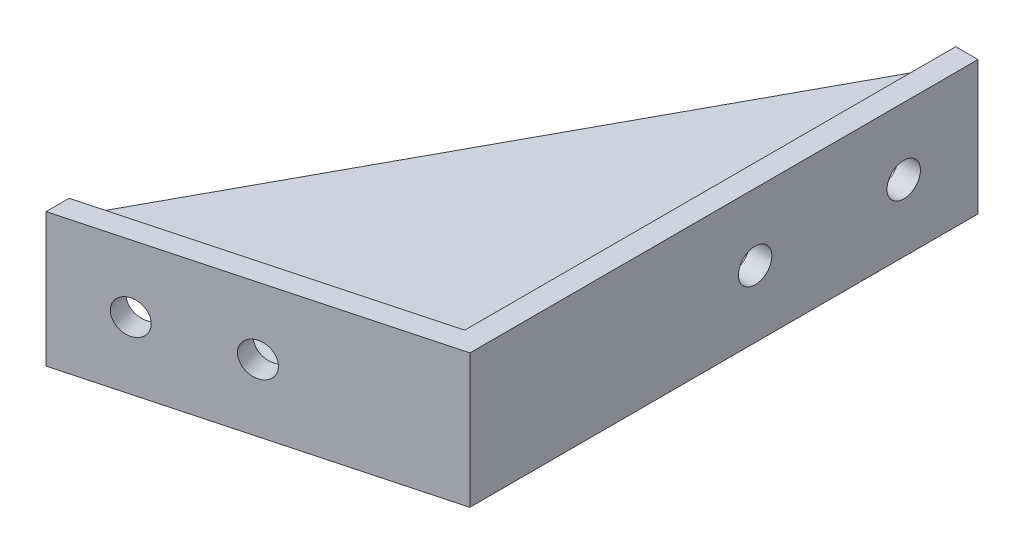
ISO-10303-21;
HEADER;
FILE_DESCRIPTION(('STEP AP214'),'2;1');
FILE_NAME('part.step','',(''),(''),'','','');
FILE_SCHEMA(('AUTOMOTIVE_DESIGN { 1 0 10303 214 1 1 1 1 }'));
ENDSEC;
DATA;
#1=APPLICATION_CONTEXT('core data for automotive mechanical design processes');
#2=APPLICATION_PROTOCOL_DEFINITION('international standard','automotive_design',2000,#1);
#3=PRODUCT_CONTEXT('',#1,'mechanical');
#4=PRODUCT('Part','Part','',(#3));
#5=PRODUCT_RELATED_PRODUCT_CATEGORY('part','',(#4));
#6=PRODUCT_DEFINITION_FORMATION('','',#4);
#7=PRODUCT_DEFINITION_CONTEXT('part definition',#1,'design');
#8=PRODUCT_DEFINITION('design','',#6,#7);
#9=PRODUCT_DEFINITION_SHAPE('','',#8);
#10=(LENGTH_UNIT() NAMED_UNIT(*) SI_UNIT(.MILLI.,.METRE.));
#11=(NAMED_UNIT(*) PLANE_ANGLE_UNIT() SI_UNIT($,.RADIAN.));
#12=(NAMED_UNIT(*) SI_UNIT($,.STERADIAN.) SOLID_ANGLE_UNIT());
#13=UNCERTAINTY_MEASURE_WITH_UNIT(LENGTH_MEASURE(1.E-05),#10,'distance_accuracy_value','');
#14=(GEOMETRIC_REPRESENTATION_CONTEXT(3) GLOBAL_UNCERTAINTY_ASSIGNED_CONTEXT((#13)) GLOBAL_UNIT_ASSIGNED_CONTEXT((#10,
#11,#12)) REPRESENTATION_CONTEXT('',''));
#15=CARTESIAN_POINT('',(0.,0.,0.));
#16=DIRECTION('',(0.,0.,1.));
#17=DIRECTION('',(1.,0.,0.));
#18=AXIS2_PLACEMENT_3D('',#15,#16,#17);
#19=CARTESIAN_POINT('',(-82.29236706485,11.5,1964.019125715));
#20=DIRECTION('',(0.,-1.,0.));
#21=DIRECTION('',(0.,0.,-1.));
#22=AXIS2_PLACEMENT_3D('',#19,#20,#21);
#23=PLANE('',#22);
#24=DIRECTION('',(-0.965925826288944,0.,0.258819045102985));
#25=VECTOR('',#24,1.);
#26=CARTESIAN_POINT('',(-56.,11.5,2005.396038073));
#27=LINE('',#26,#25);
#28=CARTESIAN_POINT('',(-56.,11.5,2005.396038073));
#29=VERTEX_POINT('',#28);
#30=CARTESIAN_POINT('',(-135.,11.5,2026.564024275));
#31=VERTEX_POINT('',#30);
#32=EDGE_CURVE('E170',#29,#31,#27,.T.);
#33=ORIENTED_EDGE('',*,*,#32,.T.);
#34=DIRECTION('',(0.477515999660203,0.,-0.878623053458374));
#35=VECTOR('',#34,1.);
#36=CARTESIAN_POINT('',(-135.,11.5,2026.564024275));
#37=LINE('',#36,#35);
#38=CARTESIAN_POINT('',(-56.,11.5,1881.205080758));
#39=VERTEX_POINT('',#38);
#40=EDGE_CURVE('E11',#31,#39,#37,.T.);
#41=ORIENTED_EDGE('',*,*,#40,.T.);
#42=DIRECTION('',(0.,0.,1.));
#43=VECTOR('',#42,1.);
#44=CARTESIAN_POINT('',(-56.,11.5,1881.205080758));
#45=LINE('',#44,#43);
#46=EDGE_CURVE('E171',#39,#29,#45,.T.);
#47=ORIENTED_EDGE('',*,*,#46,.T.);
#48=EDGE_LOOP('',(#33,#41,#47));
#49=FACE_BOUND('',#48,.T.);
#50=ADVANCED_FACE('F17',(#49),#23,.T.);
#51=CARTESIAN_POINT('',(-135.,11.5,2026.564024275));
#52=DIRECTION('',(-0.878623053458374,0.,-0.477515999660203));
#53=DIRECTION('',(-0.477515999660203,0.,0.878623053458374));
#54=AXIS2_PLACEMENT_3D('',#51,#52,#53);
#55=PLANE('',#54);
#56=DIRECTION('',(0.,1.,0.));
#57=VECTOR('',#56,1.);
#58=CARTESIAN_POINT('',(-135.,11.5,2026.564024275));
#59=LINE('',#58,#57);
#60=CARTESIAN_POINT('',(-135.,16.5,2026.564024275));
#61=VERTEX_POINT('',#60);
#62=EDGE_CURVE('E164',#31,#61,#59,.T.);
#63=ORIENTED_EDGE('',*,*,#62,.T.);
#64=DIRECTION('',(0.477515999660203,0.,-0.878623053458374));
#65=VECTOR('',#64,1.);
#66=CARTESIAN_POINT('',(-135.,16.5,2026.564024275));
#67=LINE('',#66,#65);
#68=CARTESIAN_POINT('',(-56.,16.5,1881.205080758));
#69=VERTEX_POINT('',#68);
#70=EDGE_CURVE('E25',#61,#69,#67,.T.);
#71=ORIENTED_EDGE('',*,*,#70,.T.);
#72=DIRECTION('',(0.,1.,0.));
#73=VECTOR('',#72,1.);
#74=CARTESIAN_POINT('',(-56.,11.5,1881.205080758));
#75=LINE('',#74,#73);
#76=EDGE_CURVE('E167',#39,#69,#75,.T.);
#77=ORIENTED_EDGE('',*,*,#76,.F.);
#78=ORIENTED_EDGE('',*,*,#40,.F.);
#79=EDGE_LOOP('',(#63,#71,#77,#78));
#80=FACE_BOUND('',#79,.T.);
#81=ADVANCED_FACE('F162',(#80),#55,.T.);
#82=CARTESIAN_POINT('',(-82.29236706485,-11.5,1964.019125715));
#83=DIRECTION('',(0.,-1.,0.));
#84=DIRECTION('',(0.,0.,-1.));
#85=AXIS2_PLACEMENT_3D('',#82,#83,#84);
#86=PLANE('',#85);
#87=DIRECTION('',(0.,0.,1.));
#88=VECTOR('',#87,1.);
#89=CARTESIAN_POINT('',(-56.,-11.5,1881.205080758));
#90=LINE('',#89,#88);
#91=CARTESIAN_POINT('',(-56.,-11.5,1881.205080758));
#92=VERTEX_POINT('',#91);
#93=CARTESIAN_POINT('',(-56.,-11.5,2005.396038073));
#94=VERTEX_POINT('',#93);
#95=EDGE_CURVE('E218',#92,#94,#90,.T.);
#96=ORIENTED_EDGE('',*,*,#95,.F.);
#97=DIRECTION('',(0.477515999660203,0.,-0.878623053458374));
#98=VECTOR('',#97,1.);
#99=CARTESIAN_POINT('',(-135.,-11.5,2026.564024275));
#100=LINE('',#99,#98);
#101=CARTESIAN_POINT('',(-135.,-11.5,2026.564024275));
#102=VERTEX_POINT('',#101);
#103=EDGE_CURVE('E228',#102,#92,#100,.T.);
#104=ORIENTED_EDGE('',*,*,#103,.F.);
#105=DIRECTION('',(-0.965925826288944,0.,0.258819045102985));
#106=VECTOR('',#105,1.);
#107=CARTESIAN_POINT('',(-56.,-11.5,2005.396038073));
#108=LINE('',#107,#106);
#109=EDGE_CURVE('E195',#94,#102,#108,.T.);
#110=ORIENTED_EDGE('',*,*,#109,.F.);
#111=EDGE_LOOP('',(#96,#104,#110));
#112=FACE_BOUND('',#111,.T.);
#113=ADVANCED_FACE('F394',(#112),#86,.F.);
#114=CARTESIAN_POINT('',(-82.29236706485,16.5,1964.019125715));
#115=DIRECTION('',(0.,-1.,0.));
#116=DIRECTION('',(0.,0.,-1.));
#117=AXIS2_PLACEMENT_3D('',#114,#115,#116);
#118=PLANE('',#117);
#119=DIRECTION('',(0.,0.,1.));
#120=VECTOR('',#119,1.);
#121=CARTESIAN_POINT('',(-56.,16.5,1881.205080758));
#122=LINE('',#121,#120);
#123=CARTESIAN_POINT('',(-56.,16.5,2005.396038073));
#124=VERTEX_POINT('',#123);
#125=EDGE_CURVE('E225',#69,#124,#122,.T.);
#126=ORIENTED_EDGE('',*,*,#125,.F.);
#127=ORIENTED_EDGE('',*,*,#70,.F.);
#128=DIRECTION('',(-0.965925826288944,0.,0.258819045102985));
#129=VECTOR('',#128,1.);
#130=CARTESIAN_POINT('',(-56.,16.5,2005.396038073));
#131=LINE('',#130,#129);
#132=EDGE_CURVE('E182',#124,#61,#131,.T.);
#133=ORIENTED_EDGE('',*,*,#132,.F.);
#134=EDGE_LOOP('',(#126,#127,#133));
#135=FACE_BOUND('',#134,.T.);
#136=ADVANCED_FACE('F385',(#135),#118,.F.);
#137=CARTESIAN_POINT('',(-135.,-16.5,2026.564024275));
#138=DIRECTION('',(-0.878623053458374,0.,-0.477515999660203));
#139=DIRECTION('',(-0.477515999660203,0.,0.878623053458374));
#140=AXIS2_PLACEMENT_3D('',#137,#138,#139);
#141=PLANE('',#140);
#142=DIRECTION('',(0.,1.,0.));
#143=VECTOR('',#142,1.);
#144=CARTESIAN_POINT('',(-135.,-16.5,2026.564024275));
#145=LINE('',#144,#143);
#146=CARTESIAN_POINT('',(-135.,-16.5,2026.564024275));
#147=VERTEX_POINT('',#146);
#148=EDGE_CURVE('E199',#147,#102,#145,.T.);
#149=ORIENTED_EDGE('',*,*,#148,.T.);
#150=ORIENTED_EDGE('',*,*,#103,.T.);
#151=DIRECTION('',(0.,1.,0.));
#152=VECTOR('',#151,1.);
#153=CARTESIAN_POINT('',(-56.,-16.5,1881.205080758));
#154=LINE('',#153,#152);
#155=CARTESIAN_POINT('',(-56.,-16.5,1881.205080758));
#156=VERTEX_POINT('',#155);
#157=EDGE_CURVE('E214',#156,#92,#154,.T.);
#158=ORIENTED_EDGE('',*,*,#157,.F.);
#159=DIRECTION('',(0.477515999660203,0.,-0.878623053458374));
#160=VECTOR('',#159,1.);
#161=CARTESIAN_POINT('',(-135.,-16.5,2026.564024275));
#162=LINE('',#161,#160);
#163=EDGE_CURVE('E226',#147,#156,#162,.T.);
#164=ORIENTED_EDGE('',*,*,#163,.F.);
#165=EDGE_LOOP('',(#149,#150,#158,#164));
#166=FACE_BOUND('',#165,.T.);
#167=ADVANCED_FACE('F383',(#166),#141,.T.);
#168=CARTESIAN_POINT('',(-82.29236706485,-16.5,1964.019125715));
#169=DIRECTION('',(0.,-1.,0.));
#170=DIRECTION('',(0.,0.,-1.));
#171=AXIS2_PLACEMENT_3D('',#168,#169,#170);
#172=PLANE('',#171);
#173=DIRECTION('',(-0.965925826288944,0.,0.258819045102985));
#174=VECTOR('',#173,1.);
#175=CARTESIAN_POINT('',(-56.,-16.5,2005.396038073));
#176=LINE('',#175,#174);
#177=CARTESIAN_POINT('',(-56.,-16.5,2005.396038073));
#178=VERTEX_POINT('',#177);
#179=EDGE_CURVE('E203',#178,#147,#176,.T.);
#180=ORIENTED_EDGE('',*,*,#179,.T.);
#181=ORIENTED_EDGE('',*,*,#163,.T.);
#182=DIRECTION('',(0.,0.,1.));
#183=VECTOR('',#182,1.);
#184=CARTESIAN_POINT('',(-56.,-16.5,1881.205080758));
#185=LINE('',#184,#183);
#186=EDGE_CURVE('E211',#156,#178,#185,.T.);
#187=ORIENTED_EDGE('',*,*,#186,.T.);
#188=EDGE_LOOP('',(#180,#181,#187));
#189=FACE_BOUND('',#188,.T.);
#190=ADVANCED_FACE('F382',(#189),#172,.T.);
#191=CARTESIAN_POINT('',(-56.,-18.,2005.396038073));
#192=DIRECTION('',(-1.,0.,0.));
#193=DIRECTION('',(0.,0.,1.));
#194=AXIS2_PLACEMENT_3D('',#191,#192,#193);
#195=PLANE('',#194);
#196=CARTESIAN_POINT('',(-56.,0.,1893.205080758));
#197=DIRECTION('',(-1.,0.,0.));
#198=DIRECTION('',(0.,0.,-1.));
#199=AXIS2_PLACEMENT_3D('',#196,#197,#198);
#200=CIRCLE('',#199,4.5);
#201=CARTESIAN_POINT('',(-56.,0.,1888.705080758));
#202=VERTEX_POINT('',#201);
#203=EDGE_CURVE('E280',#202,#202,#200,.T.);
#204=ORIENTED_EDGE('',*,*,#203,.F.);
#205=EDGE_LOOP('',(#204));
#206=FACE_BOUND('',#205,.T.);
#207=CARTESIAN_POINT('',(-56.,0.,1933.205080758));
#208=DIRECTION('',(-1.,0.,0.));
#209=DIRECTION('',(0.,0.,-1.));
#210=AXIS2_PLACEMENT_3D('',#207,#208,#209);
#211=CIRCLE('',#210,4.5);
#212=CARTESIAN_POINT('',(-56.,0.,1928.705080758));
#213=VERTEX_POINT('',#212);
#214=EDGE_CURVE('E288',#213,#213,#211,.T.);
#215=ORIENTED_EDGE('',*,*,#214,.F.);
#216=EDGE_LOOP('',(#215));
#217=FACE_BOUND('',#216,.T.);
#218=DIRECTION('',(0.,0.,-1.));
#219=VECTOR('',#218,1.);
#220=CARTESIAN_POINT('',(-56.,-18.,2005.396038073));
#221=LINE('',#220,#219);
#222=CARTESIAN_POINT('',(-56.,-18.,2005.396038073));
#223=VERTEX_POINT('',#222);
#224=CARTESIAN_POINT('',(-56.,-18.,1873.205080758));
#225=VERTEX_POINT('',#224);
#226=EDGE_CURVE('E254',#223,#225,#221,.T.);
#227=ORIENTED_EDGE('',*,*,#226,.F.);
#228=DIRECTION('',(0.,1.,0.));
#229=VECTOR('',#228,1.);
#230=CARTESIAN_POINT('',(-56.,-18.,2005.396038073));
#231=LINE('',#230,#229);
#232=EDGE_CURVE('E207',#223,#178,#231,.T.);
#233=ORIENTED_EDGE('',*,*,#232,.T.);
#234=ORIENTED_EDGE('',*,*,#186,.F.);
#235=ORIENTED_EDGE('',*,*,#157,.T.);
#236=ORIENTED_EDGE('',*,*,#95,.T.);
#237=DIRECTION('',(0.,1.,0.));
#238=VECTOR('',#237,1.);
#239=CARTESIAN_POINT('',(-56.,-18.,2005.396038073));
#240=LINE('',#239,#238);
#241=EDGE_CURVE('E176',#94,#29,#240,.T.);
#242=ORIENTED_EDGE('',*,*,#241,.T.);
#243=ORIENTED_EDGE('',*,*,#46,.F.);
#244=ORIENTED_EDGE('',*,*,#76,.T.);
#245=ORIENTED_EDGE('',*,*,#125,.T.);
#246=DIRECTION('',(0.,1.,0.));
#247=VECTOR('',#246,1.);
#248=CARTESIAN_POINT('',(-56.,-18.,2005.396038073));
#249=LINE('',#248,#247);
#250=CARTESIAN_POINT('',(-56.,18.,2005.396038073));
#251=VERTEX_POINT('',#250);
#252=EDGE_CURVE('E188',#124,#251,#249,.T.);
#253=ORIENTED_EDGE('',*,*,#252,.T.);
#254=DIRECTION('',(0.,0.,-1.));
#255=VECTOR('',#254,1.);
#256=CARTESIAN_POINT('',(-56.,18.,2005.396038073));
#257=LINE('',#256,#255);
#258=CARTESIAN_POINT('',(-56.,18.,1873.205080758));
#259=VERTEX_POINT('',#258);
#260=EDGE_CURVE('E249',#251,#259,#257,.T.);
#261=ORIENTED_EDGE('',*,*,#260,.T.);
#262=DIRECTION('',(0.,1.,0.));
#263=VECTOR('',#262,1.);
#264=CARTESIAN_POINT('',(-56.,-18.,1873.205080758));
#265=LINE('',#264,#263);
#266=EDGE_CURVE('E274',#225,#259,#265,.T.);
#267=ORIENTED_EDGE('',*,*,#266,.F.);
#268=EDGE_LOOP('',(#227,#233,#234,#235,#236,#242,#243,#244,#245,#253,#261,#267));
#269=FACE_BOUND('',#268,.T.);
#270=ADVANCED_FACE('F374',(#206,#217,#269),#195,.T.);
#271=CARTESIAN_POINT('',(-140.,-18.,2027.903770237));
#272=DIRECTION('',(-0.258819045102985,0.,-0.965925826288944));
#273=DIRECTION('',(-0.965925826288944,0.,0.258819045102985));
#274=AXIS2_PLACEMENT_3D('',#271,#272,#273);
#275=PLANE('',#274);
#276=CARTESIAN_POINT('',(-96.55291427061,0.,2016.262158703));
#277=DIRECTION('',(0.258819045102985,0.,0.965925826288944));
#278=DIRECTION('',(0.965925826288944,0.,-0.258819045102985));
#279=AXIS2_PLACEMENT_3D('',#276,#277,#278);
#280=CIRCLE('',#279,4.5);
#281=CARTESIAN_POINT('',(-92.20624805231,0.,2015.097473));
#282=VERTEX_POINT('',#281);
#283=EDGE_CURVE('E265',#282,#282,#280,.T.);
#284=ORIENTED_EDGE('',*,*,#283,.T.);
#285=EDGE_LOOP('',(#284));
#286=FACE_BOUND('',#285,.T.);
#287=CARTESIAN_POINT('',(-123.5529142706,0.,2023.496786898));
#288=DIRECTION('',(0.258819045102985,0.,0.965925826288944));
#289=DIRECTION('',(0.965925826288944,0.,-0.258819045102985));
#290=AXIS2_PLACEMENT_3D('',#287,#288,#289);
#291=CIRCLE('',#290,4.5);
#292=CARTESIAN_POINT('',(-119.2062480523,0.,2022.332101195));
#293=VERTEX_POINT('',#292);
#294=EDGE_CURVE('E271',#293,#293,#291,.T.);
#295=ORIENTED_EDGE('',*,*,#294,.T.);
#296=EDGE_LOOP('',(#295));
#297=FACE_BOUND('',#296,.T.);
#298=DIRECTION('',(0.965925826288944,0.,-0.258819045102985));
#299=VECTOR('',#298,1.);
#300=CARTESIAN_POINT('',(-140.,-18.,2027.903770237));
#301=LINE('',#300,#299);
#302=CARTESIAN_POINT('',(-140.,-18.,2027.903770237));
#303=VERTEX_POINT('',#302);
#304=EDGE_CURVE('E241',#303,#223,#301,.T.);
#305=ORIENTED_EDGE('',*,*,#304,.F.);
#306=DIRECTION('',(0.,1.,0.));
#307=VECTOR('',#306,1.);
#308=CARTESIAN_POINT('',(-140.,-18.,2027.903770237));
#309=LINE('',#308,#307);
#310=CARTESIAN_POINT('',(-140.,18.,2027.903770237));
#311=VERTEX_POINT('',#310);
#312=EDGE_CURVE('E261',#303,#311,#309,.T.);
#313=ORIENTED_EDGE('',*,*,#312,.T.);
#314=DIRECTION('',(0.965925826288944,0.,-0.258819045102985));
#315=VECTOR('',#314,1.);
#316=CARTESIAN_POINT('',(-140.,18.,2027.903770237));
#317=LINE('',#316,#315);
#318=EDGE_CURVE('E244',#311,#251,#317,.T.);
#319=ORIENTED_EDGE('',*,*,#318,.T.);
#320=ORIENTED_EDGE('',*,*,#252,.F.);
#321=ORIENTED_EDGE('',*,*,#132,.T.);
#322=ORIENTED_EDGE('',*,*,#62,.F.);
#323=ORIENTED_EDGE('',*,*,#32,.F.);
#324=ORIENTED_EDGE('',*,*,#241,.F.);
#325=ORIENTED_EDGE('',*,*,#109,.T.);
#326=ORIENTED_EDGE('',*,*,#148,.F.);
#327=ORIENTED_EDGE('',*,*,#179,.F.);
#328=ORIENTED_EDGE('',*,*,#232,.F.);
#329=EDGE_LOOP('',(#305,#313,#319,#320,#321,#322,#323,#324,#325,#326,#327,#328));
#330=FACE_BOUND('',#329,.T.);
#331=ADVANCED_FACE('F179',(#286,#297,#330),#275,.T.);
#332=CARTESIAN_POINT('',(-49.,0.,1933.205080758));
#333=DIRECTION('',(-1.,0.,0.));
#334=DIRECTION('',(0.,0.,-1.));
#335=AXIS2_PLACEMENT_3D('',#332,#333,#334);
#336=CYLINDRICAL_SURFACE('',#335,4.5);
#337=DIRECTION('',(-1.,0.,0.));
#338=VECTOR('',#337,1.);
#339=CARTESIAN_POINT('',(-49.,0.,1928.705080758));
#340=LINE('',#339,#338);
#341=CARTESIAN_POINT('',(-50.,0.,1928.705080758));
#342=VERTEX_POINT('',#341);
#343=EDGE_CURVE('E282',#342,#213,#340,.T.);
#344=ORIENTED_EDGE('',*,*,#343,.F.);
#345=CARTESIAN_POINT('',(-50.,0.,1933.205080758));
#346=DIRECTION('',(-1.,0.,0.));
#347=DIRECTION('',(0.,0.,-1.));
#348=AXIS2_PLACEMENT_3D('',#345,#346,#347);
#349=CIRCLE('',#348,4.5);
#350=EDGE_CURVE('E299',#342,#342,#349,.T.);
#351=ORIENTED_EDGE('',*,*,#350,.F.);
#352=ORIENTED_EDGE('',*,*,#343,.T.);
#353=ORIENTED_EDGE('',*,*,#214,.T.);
#354=EDGE_LOOP('',(#344,#351,#352,#353));
#355=FACE_BOUND('',#354,.T.);
#356=ADVANCED_FACE('F414',(#355),#336,.F.);
#357=CARTESIAN_POINT('',(-49.,0.,1893.205080758));
#358=DIRECTION('',(-1.,0.,0.));
#359=DIRECTION('',(0.,0.,-1.));
#360=AXIS2_PLACEMENT_3D('',#357,#358,#359);
#361=CYLINDRICAL_SURFACE('',#360,4.5);
#362=DIRECTION('',(-1.,0.,0.));
#363=VECTOR('',#362,1.);
#364=CARTESIAN_POINT('',(-49.,0.,1888.705080758));
#365=LINE('',#364,#363);
#366=CARTESIAN_POINT('',(-50.,0.,1888.705080758));
#367=VERTEX_POINT('',#366);
#368=EDGE_CURVE('E277',#367,#202,#365,.T.);
#369=ORIENTED_EDGE('',*,*,#368,.F.);
#370=CARTESIAN_POINT('',(-50.,0.,1893.205080758));
#371=DIRECTION('',(-1.,0.,0.));
#372=DIRECTION('',(0.,0.,-1.));
#373=AXIS2_PLACEMENT_3D('',#370,#371,#372);
#374=CIRCLE('',#373,4.5);
#375=EDGE_CURVE('E300',#367,#367,#374,.T.);
#376=ORIENTED_EDGE('',*,*,#375,.F.);
#377=ORIENTED_EDGE('',*,*,#368,.T.);
#378=ORIENTED_EDGE('',*,*,#203,.T.);
#379=EDGE_LOOP('',(#369,#376,#377,#378));
#380=FACE_BOUND('',#379,.T.);
#381=ADVANCED_FACE('F416',(#380),#361,.F.);
#382=CARTESIAN_POINT('',(-56.,-18.,1873.205080758));
#383=DIRECTION('',(0.,0.,-1.));
#384=DIRECTION('',(0.,-1.,0.));
#385=AXIS2_PLACEMENT_3D('',#382,#383,#384);
#386=PLANE('',#385);
#387=ORIENTED_EDGE('',*,*,#266,.T.);
#388=DIRECTION('',(1.,0.,0.));
#389=VECTOR('',#388,1.);
#390=CARTESIAN_POINT('',(-56.,18.,1873.205080758));
#391=LINE('',#390,#389);
#392=CARTESIAN_POINT('',(-50.,18.,1873.205080758));
#393=VERTEX_POINT('',#392);
#394=EDGE_CURVE('E253',#259,#393,#391,.T.);
#395=ORIENTED_EDGE('',*,*,#394,.T.);
#396=DIRECTION('',(0.,1.,0.));
#397=VECTOR('',#396,1.);
#398=CARTESIAN_POINT('',(-50.,-18.,1873.205080758));
#399=LINE('',#398,#397);
#400=CARTESIAN_POINT('',(-50.,-18.,1873.205080758));
#401=VERTEX_POINT('',#400);
#402=EDGE_CURVE('E307',#401,#393,#399,.T.);
#403=ORIENTED_EDGE('',*,*,#402,.F.);
#404=DIRECTION('',(1.,0.,0.));
#405=VECTOR('',#404,1.);
#406=CARTESIAN_POINT('',(-56.,-18.,1873.205080758));
#407=LINE('',#406,#405);
#408=EDGE_CURVE('E250',#225,#401,#407,.T.);
#409=ORIENTED_EDGE('',*,*,#408,.F.);
#410=EDGE_LOOP('',(#387,#395,#403,#409));
#411=FACE_BOUND('',#410,.T.);
#412=ADVANCED_FACE('F372',(#411),#386,.T.);
#413=CARTESIAN_POINT('',(-123.8117333157,0.,2022.530861072));
#414=DIRECTION('',(0.258819045102985,0.,0.965925826288944));
#415=DIRECTION('',(0.965925826288944,0.,-0.258819045102985));
#416=AXIS2_PLACEMENT_3D('',#413,#414,#415);
#417=CYLINDRICAL_SURFACE('',#416,4.5);
#418=DIRECTION('',(0.258819045102985,0.,0.965925826288944));
#419=VECTOR('',#418,1.);
#420=CARTESIAN_POINT('',(-119.4650670974,0.,2021.366175369));
#421=LINE('',#420,#419);
#422=CARTESIAN_POINT('',(-117.6533337816,0.,2028.127656153));
#423=VERTEX_POINT('',#422);
#424=EDGE_CURVE('E268',#293,#423,#421,.T.);
#425=ORIENTED_EDGE('',*,*,#424,.F.);
#426=ORIENTED_EDGE('',*,*,#294,.F.);
#427=ORIENTED_EDGE('',*,*,#424,.T.);
#428=CARTESIAN_POINT('',(-122.,0.,2029.292341856));
#429=DIRECTION('',(0.258819045102985,0.,0.965925826288944));
#430=DIRECTION('',(0.965925826288944,0.,-0.258819045102985));
#431=AXIS2_PLACEMENT_3D('',#428,#429,#430);
#432=CIRCLE('',#431,4.5);
#433=EDGE_CURVE('E311',#423,#423,#432,.T.);
#434=ORIENTED_EDGE('',*,*,#433,.T.);
#435=EDGE_LOOP('',(#425,#426,#427,#434));
#436=FACE_BOUND('',#435,.T.);
#437=ADVANCED_FACE('F422',(#436),#417,.F.);
#438=CARTESIAN_POINT('',(-96.81173331571,0.,2015.296232876));
#439=DIRECTION('',(0.258819045102985,0.,0.965925826288944));
#440=DIRECTION('',(0.965925826288944,0.,-0.258819045102985));
#441=AXIS2_PLACEMENT_3D('',#438,#439,#440);
#442=CYLINDRICAL_SURFACE('',#441,4.5);
#443=DIRECTION('',(0.258819045102985,0.,0.965925826288944));
#444=VECTOR('',#443,1.);
#445=CARTESIAN_POINT('',(-92.46506709741,0.,2014.131547173));
#446=LINE('',#445,#444);
#447=CARTESIAN_POINT('',(-90.65333378169,0.,2020.893027958));
#448=VERTEX_POINT('',#447);
#449=EDGE_CURVE('E262',#282,#448,#446,.T.);
#450=ORIENTED_EDGE('',*,*,#449,.F.);
#451=ORIENTED_EDGE('',*,*,#283,.F.);
#452=ORIENTED_EDGE('',*,*,#449,.T.);
#453=CARTESIAN_POINT('',(-95.,0.,2022.05771366));
#454=DIRECTION('',(0.258819045102985,0.,0.965925826288944));
#455=DIRECTION('',(0.965925826288944,0.,-0.258819045102985));
#456=AXIS2_PLACEMENT_3D('',#453,#454,#455);
#457=CIRCLE('',#456,4.5);
#458=EDGE_CURVE('E319',#448,#448,#457,.T.);
#459=ORIENTED_EDGE('',*,*,#458,.T.);
#460=EDGE_LOOP('',(#450,#451,#452,#459));
#461=FACE_BOUND('',#460,.T.);
#462=ADVANCED_FACE('F442',(#461),#442,.F.);
#463=CARTESIAN_POINT('',(-140.,-18.,2034.11542732));
#464=DIRECTION('',(-1.,0.,0.));
#465=DIRECTION('',(0.,0.,1.));
#466=AXIS2_PLACEMENT_3D('',#463,#464,#465);
#467=PLANE('',#466);
#468=DIRECTION('',(0.,1.,0.));
#469=VECTOR('',#468,1.);
#470=CARTESIAN_POINT('',(-140.,-18.,2034.11542732));
#471=LINE('',#470,#469);
#472=CARTESIAN_POINT('',(-140.,-18.,2034.11542732));
#473=VERTEX_POINT('',#472);
#474=CARTESIAN_POINT('',(-140.,18.,2034.11542732));
#475=VERTEX_POINT('',#474);
#476=EDGE_CURVE('E329',#473,#475,#471,.T.);
#477=ORIENTED_EDGE('',*,*,#476,.T.);
#478=DIRECTION('',(0.,0.,-1.));
#479=VECTOR('',#478,1.);
#480=CARTESIAN_POINT('',(-140.,18.,2034.11542732));
#481=LINE('',#480,#479);
#482=EDGE_CURVE('E248',#475,#311,#481,.T.);
#483=ORIENTED_EDGE('',*,*,#482,.T.);
#484=ORIENTED_EDGE('',*,*,#312,.F.);
#485=DIRECTION('',(0.,0.,-1.));
#486=VECTOR('',#485,1.);
#487=CARTESIAN_POINT('',(-140.,-18.,2034.11542732));
#488=LINE('',#487,#486);
#489=EDGE_CURVE('E296',#473,#303,#488,.T.);
#490=ORIENTED_EDGE('',*,*,#489,.F.);
#491=EDGE_LOOP('',(#477,#483,#484,#490));
#492=FACE_BOUND('',#491,.T.);
#493=ADVANCED_FACE('F365',(#492),#467,.T.);
#494=CARTESIAN_POINT('',(-95.,18.,2018.951885119));
#495=DIRECTION('',(0.,-1.,0.));
#496=DIRECTION('',(0.,0.,-1.));
#497=AXIS2_PLACEMENT_3D('',#494,#495,#496);
#498=PLANE('',#497);
#499=DIRECTION('',(0.,0.,1.));
#500=VECTOR('',#499,1.);
#501=CARTESIAN_POINT('',(-50.,18.,1873.205080758));
#502=LINE('',#501,#500);
#503=CARTESIAN_POINT('',(-50.,18.,2010.000000001));
#504=VERTEX_POINT('',#503);
#505=EDGE_CURVE('E304',#393,#504,#502,.T.);
#506=ORIENTED_EDGE('',*,*,#505,.F.);
#507=ORIENTED_EDGE('',*,*,#394,.F.);
#508=ORIENTED_EDGE('',*,*,#260,.F.);
#509=ORIENTED_EDGE('',*,*,#318,.F.);
#510=ORIENTED_EDGE('',*,*,#482,.F.);
#511=DIRECTION('',(-0.965925826288944,0.,0.258819045102985));
#512=VECTOR('',#511,1.);
#513=CARTESIAN_POINT('',(-50.,18.,2010.000000001));
#514=LINE('',#513,#512);
#515=EDGE_CURVE('E336',#504,#475,#514,.T.);
#516=ORIENTED_EDGE('',*,*,#515,.F.);
#517=EDGE_LOOP('',(#506,#507,#508,#509,#510,#516));
#518=FACE_BOUND('',#517,.T.);
#519=ADVANCED_FACE('F361',(#518),#498,.F.);
#520=CARTESIAN_POINT('',(-95.,-18.,2018.951885119));
#521=DIRECTION('',(0.,-1.,0.));
#522=DIRECTION('',(0.,0.,-1.));
#523=AXIS2_PLACEMENT_3D('',#520,#521,#522);
#524=PLANE('',#523);
#525=DIRECTION('',(-0.965925826288944,0.,0.258819045102985));
#526=VECTOR('',#525,1.);
#527=CARTESIAN_POINT('',(-50.,-18.,2010.000000001));
#528=LINE('',#527,#526);
#529=CARTESIAN_POINT('',(-50.,-18.,2010.000000001));
#530=VERTEX_POINT('',#529);
#531=EDGE_CURVE('E325',#530,#473,#528,.T.);
#532=ORIENTED_EDGE('',*,*,#531,.T.);
#533=ORIENTED_EDGE('',*,*,#489,.T.);
#534=ORIENTED_EDGE('',*,*,#304,.T.);
#535=ORIENTED_EDGE('',*,*,#226,.T.);
#536=ORIENTED_EDGE('',*,*,#408,.T.);
#537=DIRECTION('',(0.,0.,-1.));
#538=VECTOR('',#537,1.);
#539=CARTESIAN_POINT('',(-50.,-18.,2010.000000001));
#540=LINE('',#539,#538);
#541=EDGE_CURVE('E308',#530,#401,#540,.T.);
#542=ORIENTED_EDGE('',*,*,#541,.F.);
#543=EDGE_LOOP('',(#532,#533,#534,#535,#536,#542));
#544=FACE_BOUND('',#543,.T.);
#545=ADVANCED_FACE('F368',(#544),#524,.T.);
#546=CARTESIAN_POINT('',(-50.,-18.,2003.788342919));
#547=DIRECTION('',(1.,0.,0.));
#548=DIRECTION('',(0.,1.,0.));
#549=AXIS2_PLACEMENT_3D('',#546,#547,#548);
#550=PLANE('',#549);
#551=ORIENTED_EDGE('',*,*,#350,.T.);
#552=EDGE_LOOP('',(#551));
#553=FACE_BOUND('',#552,.T.);
#554=ORIENTED_EDGE('',*,*,#375,.T.);
#555=EDGE_LOOP('',(#554));
#556=FACE_BOUND('',#555,.T.);
#557=DIRECTION('',(0.,1.,0.));
#558=VECTOR('',#557,1.);
#559=CARTESIAN_POINT('',(-50.,-18.,2010.000000001));
#560=LINE('',#559,#558);
#561=EDGE_CURVE('E343',#530,#504,#560,.T.);
#562=ORIENTED_EDGE('',*,*,#561,.F.);
#563=ORIENTED_EDGE('',*,*,#541,.T.);
#564=ORIENTED_EDGE('',*,*,#402,.T.);
#565=ORIENTED_EDGE('',*,*,#505,.T.);
#566=EDGE_LOOP('',(#562,#563,#564,#565));
#567=FACE_BOUND('',#566,.T.);
#568=ADVANCED_FACE('F356',(#553,#556,#567),#550,.T.);
#569=CARTESIAN_POINT('',(-50.,-18.,2010.000000001));
#570=DIRECTION('',(0.258819045102985,0.,0.965925826288944));
#571=DIRECTION('',(0.,-1.,0.));
#572=AXIS2_PLACEMENT_3D('',#569,#570,#571);
#573=PLANE('',#572);
#574=ORIENTED_EDGE('',*,*,#433,.F.);
#575=EDGE_LOOP('',(#574));
#576=FACE_BOUND('',#575,.T.);
#577=ORIENTED_EDGE('',*,*,#458,.F.);
#578=EDGE_LOOP('',(#577));
#579=FACE_BOUND('',#578,.T.);
#580=ORIENTED_EDGE('',*,*,#561,.T.);
#581=ORIENTED_EDGE('',*,*,#515,.T.);
#582=ORIENTED_EDGE('',*,*,#476,.F.);
#583=ORIENTED_EDGE('',*,*,#531,.F.);
#584=EDGE_LOOP('',(#580,#581,#582,#583));
#585=FACE_BOUND('',#584,.T.);
#586=ADVANCED_FACE('F352',(#576,#579,#585),#573,.T.);
#587=CLOSED_SHELL('',(#50,#81,#113,#136,#167,#190,#270,#331,#356,#381,#412,#437,#462,#493,#519,
#545,#568,#586));
#588=MANIFOLD_SOLID_BREP('B1',#587);
#589=ADVANCED_BREP_SHAPE_REPRESENTATION('',(#18,#588),#14);
#590=SHAPE_DEFINITION_REPRESENTATION(#9,#589);
ENDSEC;
END-ISO-10303-21;
